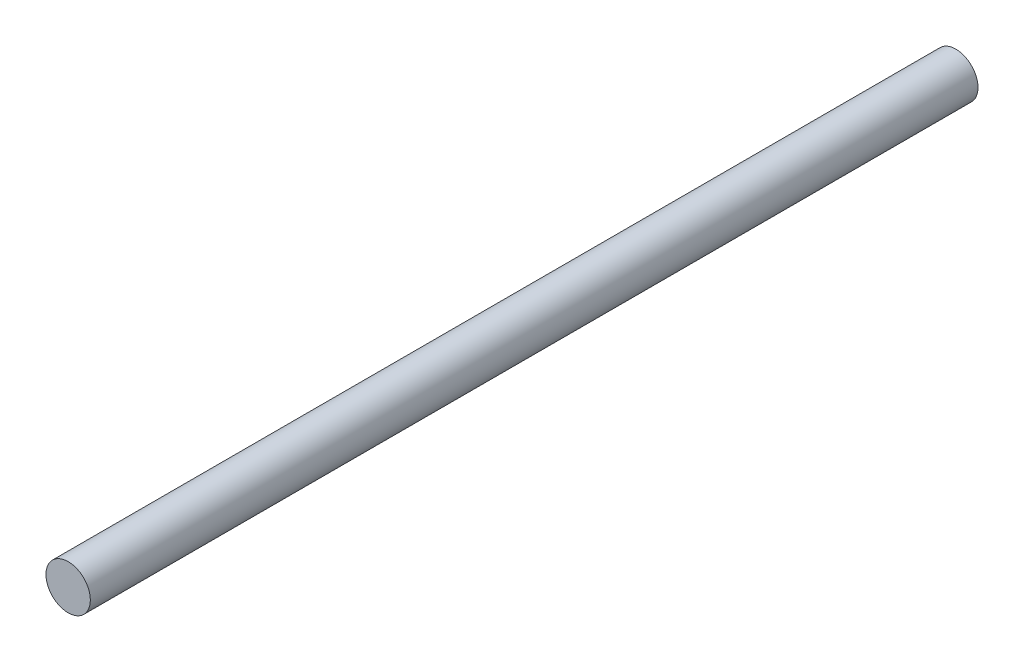
ISO-10303-21;
HEADER;
FILE_DESCRIPTION(('STEP AP214'),'2;1');
FILE_NAME('part.step','',(''),(''),'','','');
FILE_SCHEMA(('AUTOMOTIVE_DESIGN { 1 0 10303 214 1 1 1 1 }'));
ENDSEC;
DATA;
#1=APPLICATION_CONTEXT('core data for automotive mechanical design processes');
#2=APPLICATION_PROTOCOL_DEFINITION('international standard','automotive_design',2000,#1);
#3=PRODUCT_CONTEXT('',#1,'mechanical');
#4=PRODUCT('Part','Part','',(#3));
#5=PRODUCT_RELATED_PRODUCT_CATEGORY('part','',(#4));
#6=PRODUCT_DEFINITION_FORMATION('','',#4);
#7=PRODUCT_DEFINITION_CONTEXT('part definition',#1,'design');
#8=PRODUCT_DEFINITION('design','',#6,#7);
#9=PRODUCT_DEFINITION_SHAPE('','',#8);
#10=(LENGTH_UNIT() NAMED_UNIT(*) SI_UNIT(.MILLI.,.METRE.));
#11=(NAMED_UNIT(*) PLANE_ANGLE_UNIT() SI_UNIT($,.RADIAN.));
#12=(NAMED_UNIT(*) SI_UNIT($,.STERADIAN.) SOLID_ANGLE_UNIT());
#13=UNCERTAINTY_MEASURE_WITH_UNIT(LENGTH_MEASURE(1.E-05),#10,'distance_accuracy_value','');
#14=(GEOMETRIC_REPRESENTATION_CONTEXT(3) GLOBAL_UNCERTAINTY_ASSIGNED_CONTEXT((#13)) GLOBAL_UNIT_ASSIGNED_CONTEXT((#10,
#11,#12)) REPRESENTATION_CONTEXT('',''));
#15=CARTESIAN_POINT('',(0.,0.,0.));
#16=DIRECTION('',(0.,0.,1.));
#17=DIRECTION('',(1.,0.,0.));
#18=AXIS2_PLACEMENT_3D('',#15,#16,#17);
#19=CARTESIAN_POINT('',(0.,0.,100.));
#20=DIRECTION('',(0.,0.,-1.));
#21=DIRECTION('',(-1.,0.,0.));
#22=AXIS2_PLACEMENT_3D('',#19,#20,#21);
#23=CYLINDRICAL_SURFACE('',#22,2.5);
#24=CARTESIAN_POINT('',(0.,0.,100.));
#25=DIRECTION('',(0.,0.,1.));
#26=DIRECTION('',(1.,0.,0.));
#27=AXIS2_PLACEMENT_3D('',#24,#25,#26);
#28=CIRCLE('',#27,2.5);
#29=CARTESIAN_POINT('',(2.5,0.,100.));
#30=VERTEX_POINT('',#29);
#31=EDGE_CURVE('E10',#30,#30,#28,.T.);
#32=ORIENTED_EDGE('',*,*,#31,.F.);
#33=EDGE_LOOP('',(#32));
#34=FACE_BOUND('',#33,.T.);
#35=CARTESIAN_POINT('',(0.,0.,0.));
#36=DIRECTION('',(0.,0.,1.));
#37=DIRECTION('',(1.,0.,0.));
#38=AXIS2_PLACEMENT_3D('',#35,#36,#37);
#39=CIRCLE('',#38,2.5);
#40=CARTESIAN_POINT('',(2.5,0.,0.));
#41=VERTEX_POINT('',#40);
#42=EDGE_CURVE('E34',#41,#41,#39,.T.);
#43=ORIENTED_EDGE('',*,*,#42,.T.);
#44=EDGE_LOOP('',(#43));
#45=FACE_BOUND('',#44,.T.);
#46=ADVANCED_FACE('F31',(#34,#45),#23,.T.);
#47=CARTESIAN_POINT('',(0.,0.,100.));
#48=DIRECTION('',(0.,0.,1.));
#49=DIRECTION('',(1.,0.,0.));
#50=AXIS2_PLACEMENT_3D('',#47,#48,#49);
#51=PLANE('',#50);
#52=ORIENTED_EDGE('',*,*,#31,.T.);
#53=EDGE_LOOP('',(#52));
#54=FACE_BOUND('',#53,.T.);
#55=ADVANCED_FACE('F46',(#54),#51,.T.);
#56=CARTESIAN_POINT('',(0.,0.,0.));
#57=DIRECTION('',(0.,0.,1.));
#58=DIRECTION('',(1.,0.,0.));
#59=AXIS2_PLACEMENT_3D('',#56,#57,#58);
#60=PLANE('',#59);
#61=ORIENTED_EDGE('',*,*,#42,.F.);
#62=EDGE_LOOP('',(#61));
#63=FACE_BOUND('',#62,.T.);
#64=ADVANCED_FACE('F44',(#63),#60,.F.);
#65=CLOSED_SHELL('',(#46,#55,#64));
#66=MANIFOLD_SOLID_BREP('B2',#65);
#67=ADVANCED_BREP_SHAPE_REPRESENTATION('',(#18,#66),#14);
#68=SHAPE_DEFINITION_REPRESENTATION(#9,#67);
ENDSEC;
END-ISO-10303-21;
